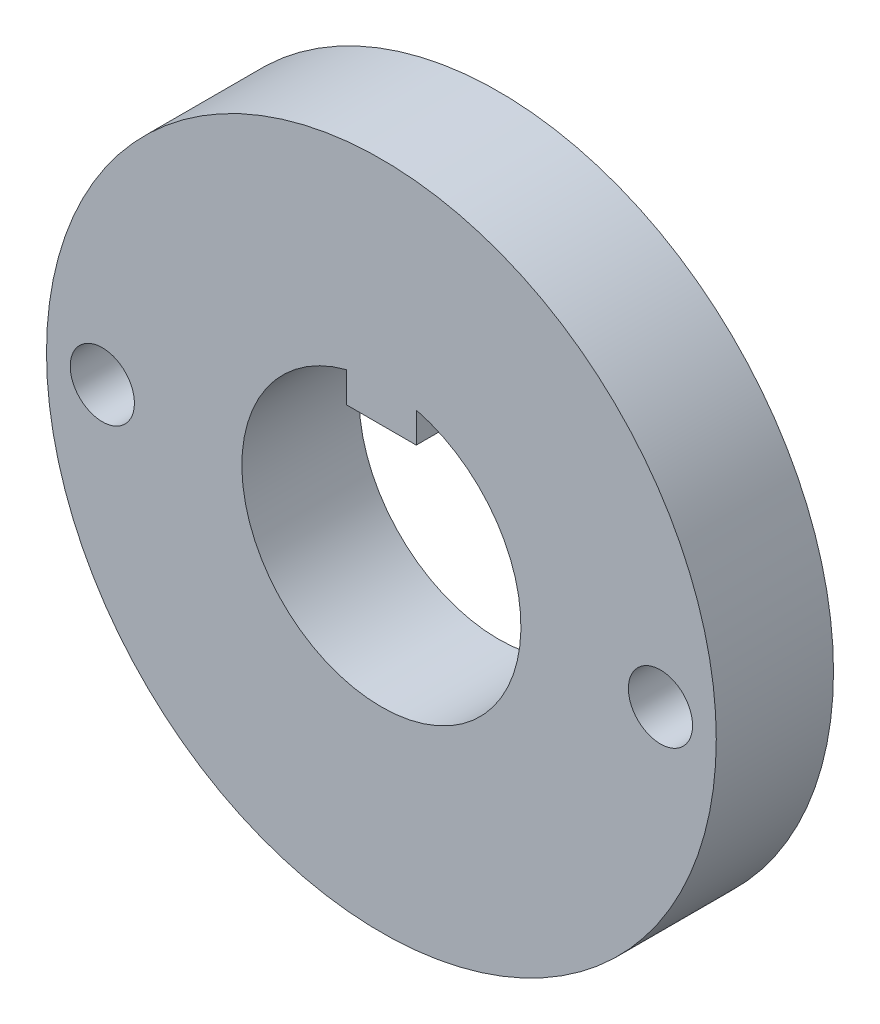
ISO-10303-21;
HEADER;
FILE_DESCRIPTION(('STEP AP214'),'2;1');
FILE_NAME('part.step','',(''),(''),'','','');
FILE_SCHEMA(('AUTOMOTIVE_DESIGN { 1 0 10303 214 1 1 1 1 }'));
ENDSEC;
DATA;
#1=APPLICATION_CONTEXT('core data for automotive mechanical design processes');
#2=APPLICATION_PROTOCOL_DEFINITION('international standard','automotive_design',2000,#1);
#3=PRODUCT_CONTEXT('',#1,'mechanical');
#4=PRODUCT('Part','Part','',(#3));
#5=PRODUCT_RELATED_PRODUCT_CATEGORY('part','',(#4));
#6=PRODUCT_DEFINITION_FORMATION('','',#4);
#7=PRODUCT_DEFINITION_CONTEXT('part definition',#1,'design');
#8=PRODUCT_DEFINITION('design','',#6,#7);
#9=PRODUCT_DEFINITION_SHAPE('','',#8);
#10=(LENGTH_UNIT() NAMED_UNIT(*) SI_UNIT(.MILLI.,.METRE.));
#11=(NAMED_UNIT(*) PLANE_ANGLE_UNIT() SI_UNIT($,.RADIAN.));
#12=(NAMED_UNIT(*) SI_UNIT($,.STERADIAN.) SOLID_ANGLE_UNIT());
#13=UNCERTAINTY_MEASURE_WITH_UNIT(LENGTH_MEASURE(1.E-05),#10,'distance_accuracy_value','');
#14=(GEOMETRIC_REPRESENTATION_CONTEXT(3) GLOBAL_UNCERTAINTY_ASSIGNED_CONTEXT((#13)) GLOBAL_UNIT_ASSIGNED_CONTEXT((#10,
#11,#12)) REPRESENTATION_CONTEXT('',''));
#15=CARTESIAN_POINT('',(0.,0.,0.));
#16=DIRECTION('',(0.,0.,1.));
#17=DIRECTION('',(1.,0.,0.));
#18=AXIS2_PLACEMENT_3D('',#15,#16,#17);
#19=CARTESIAN_POINT('',(0.,0.,2.667));
#20=DIRECTION('',(0.,0.,1.));
#21=DIRECTION('',(1.,0.,0.));
#22=AXIS2_PLACEMENT_3D('',#19,#20,#21);
#23=PLANE('',#22);
#24=CARTESIAN_POINT('',(-12.7,0.,2.667));
#25=DIRECTION('',(0.,0.,1.));
#26=DIRECTION('',(1.,0.,0.));
#27=AXIS2_PLACEMENT_3D('',#24,#25,#26);
#28=CIRCLE('',#27,1.46050000000001);
#29=CARTESIAN_POINT('',(-11.2395,0.,2.667));
#30=VERTEX_POINT('',#29);
#31=EDGE_CURVE('E109',#30,#30,#28,.T.);
#32=ORIENTED_EDGE('',*,*,#31,.F.);
#33=EDGE_LOOP('',(#32));
#34=FACE_BOUND('',#33,.T.);
#35=CARTESIAN_POINT('',(12.7,0.,2.667));
#36=DIRECTION('',(0.,0.,1.));
#37=DIRECTION('',(1.,0.,0.));
#38=AXIS2_PLACEMENT_3D('',#35,#36,#37);
#39=CIRCLE('',#38,1.4605);
#40=CARTESIAN_POINT('',(14.1605,0.,2.667));
#41=VERTEX_POINT('',#40);
#42=EDGE_CURVE('E116',#41,#41,#39,.T.);
#43=ORIENTED_EDGE('',*,*,#42,.F.);
#44=EDGE_LOOP('',(#43));
#45=FACE_BOUND('',#44,.T.);
#46=CARTESIAN_POINT('',(0.,0.,2.667));
#47=DIRECTION('',(0.,0.,1.));
#48=DIRECTION('',(1.,0.,0.));
#49=AXIS2_PLACEMENT_3D('',#46,#47,#48);
#50=CIRCLE('',#49,15.24);
#51=CARTESIAN_POINT('',(15.24,0.,2.667));
#52=VERTEX_POINT('',#51);
#53=EDGE_CURVE('E11',#52,#52,#50,.T.);
#54=ORIENTED_EDGE('',*,*,#53,.T.);
#55=EDGE_LOOP('',(#54));
#56=FACE_BOUND('',#55,.T.);
#57=CARTESIAN_POINT('',(0.,0.,2.667));
#58=DIRECTION('',(0.,0.,1.));
#59=DIRECTION('',(1.,0.,0.));
#60=AXIS2_PLACEMENT_3D('',#57,#58,#59);
#61=CIRCLE('',#60,6.35);
#62=CARTESIAN_POINT('',(-1.5875,6.14836106210427,2.667));
#63=VERTEX_POINT('',#62);
#64=CARTESIAN_POINT('',(1.5875,6.14836106210427,2.667));
#65=VERTEX_POINT('',#64);
#66=EDGE_CURVE('E63',#63,#65,#61,.T.);
#67=ORIENTED_EDGE('',*,*,#66,.F.);
#68=DIRECTION('',(0.,-1.,0.));
#69=VECTOR('',#68,1.);
#70=CARTESIAN_POINT('',(-1.5875,0.,2.667));
#71=LINE('',#70,#69);
#72=CARTESIAN_POINT('',(-1.5875,4.7625,2.667));
#73=VERTEX_POINT('',#72);
#74=EDGE_CURVE('E106',#63,#73,#71,.T.);
#75=ORIENTED_EDGE('',*,*,#74,.T.);
#76=DIRECTION('',(1.,0.,0.));
#77=VECTOR('',#76,1.);
#78=CARTESIAN_POINT('',(0.,4.7625,2.667));
#79=LINE('',#78,#77);
#80=CARTESIAN_POINT('',(1.5875,4.7625,2.667));
#81=VERTEX_POINT('',#80);
#82=EDGE_CURVE('E55',#73,#81,#79,.T.);
#83=ORIENTED_EDGE('',*,*,#82,.T.);
#84=DIRECTION('',(0.,-1.,0.));
#85=VECTOR('',#84,1.);
#86=CARTESIAN_POINT('',(1.5875,0.,2.667));
#87=LINE('',#86,#85);
#88=EDGE_CURVE('E49',#65,#81,#87,.T.);
#89=ORIENTED_EDGE('',*,*,#88,.F.);
#90=EDGE_LOOP('',(#67,#75,#83,#89));
#91=FACE_BOUND('',#90,.T.);
#92=ADVANCED_FACE('F34',(#34,#45,#56,#91),#23,.T.);
#93=CARTESIAN_POINT('',(0.,0.,-2.667));
#94=DIRECTION('',(0.,0.,1.));
#95=DIRECTION('',(1.,0.,0.));
#96=AXIS2_PLACEMENT_3D('',#93,#94,#95);
#97=PLANE('',#96);
#98=CARTESIAN_POINT('',(-12.7,0.,-2.667));
#99=DIRECTION('',(0.,0.,1.));
#100=DIRECTION('',(1.,0.,0.));
#101=AXIS2_PLACEMENT_3D('',#98,#99,#100);
#102=CIRCLE('',#101,1.46050000000001);
#103=CARTESIAN_POINT('',(-11.2395,0.,-2.667));
#104=VERTEX_POINT('',#103);
#105=EDGE_CURVE('E113',#104,#104,#102,.T.);
#106=ORIENTED_EDGE('',*,*,#105,.T.);
#107=EDGE_LOOP('',(#106));
#108=FACE_BOUND('',#107,.T.);
#109=CARTESIAN_POINT('',(12.7,0.,-2.667));
#110=DIRECTION('',(0.,0.,1.));
#111=DIRECTION('',(1.,0.,0.));
#112=AXIS2_PLACEMENT_3D('',#109,#110,#111);
#113=CIRCLE('',#112,1.4605);
#114=CARTESIAN_POINT('',(14.1605,0.,-2.667));
#115=VERTEX_POINT('',#114);
#116=EDGE_CURVE('E119',#115,#115,#113,.T.);
#117=ORIENTED_EDGE('',*,*,#116,.T.);
#118=EDGE_LOOP('',(#117));
#119=FACE_BOUND('',#118,.T.);
#120=CARTESIAN_POINT('',(0.,0.,-2.667));
#121=DIRECTION('',(0.,0.,1.));
#122=DIRECTION('',(1.,0.,0.));
#123=AXIS2_PLACEMENT_3D('',#120,#121,#122);
#124=CIRCLE('',#123,15.24);
#125=CARTESIAN_POINT('',(15.24,0.,-2.667));
#126=VERTEX_POINT('',#125);
#127=EDGE_CURVE('E38',#126,#126,#124,.T.);
#128=ORIENTED_EDGE('',*,*,#127,.F.);
#129=EDGE_LOOP('',(#128));
#130=FACE_BOUND('',#129,.T.);
#131=DIRECTION('',(0.,1.,0.));
#132=VECTOR('',#131,1.);
#133=CARTESIAN_POINT('',(1.5875,0.,-2.667));
#134=LINE('',#133,#132);
#135=CARTESIAN_POINT('',(1.5875,4.7625,-2.667));
#136=VERTEX_POINT('',#135);
#137=CARTESIAN_POINT('',(1.5875,6.14836106210427,-2.667));
#138=VERTEX_POINT('',#137);
#139=EDGE_CURVE('E98',#136,#138,#134,.T.);
#140=ORIENTED_EDGE('',*,*,#139,.F.);
#141=DIRECTION('',(-1.,0.,0.));
#142=VECTOR('',#141,1.);
#143=CARTESIAN_POINT('',(0.,4.7625,-2.667));
#144=LINE('',#143,#142);
#145=CARTESIAN_POINT('',(-1.5875,4.7625,-2.667));
#146=VERTEX_POINT('',#145);
#147=EDGE_CURVE('E88',#136,#146,#144,.T.);
#148=ORIENTED_EDGE('',*,*,#147,.T.);
#149=DIRECTION('',(0.,1.,0.));
#150=VECTOR('',#149,1.);
#151=CARTESIAN_POINT('',(-1.5875,0.,-2.667));
#152=LINE('',#151,#150);
#153=CARTESIAN_POINT('',(-1.5875,6.14836106210427,-2.667));
#154=VERTEX_POINT('',#153);
#155=EDGE_CURVE('E97',#146,#154,#152,.T.);
#156=ORIENTED_EDGE('',*,*,#155,.T.);
#157=CARTESIAN_POINT('',(0.,0.,-2.667));
#158=DIRECTION('',(0.,0.,1.));
#159=DIRECTION('',(1.,0.,0.));
#160=AXIS2_PLACEMENT_3D('',#157,#158,#159);
#161=CIRCLE('',#160,6.35);
#162=EDGE_CURVE('E162',#138,#154,#161,.F.);
#163=ORIENTED_EDGE('',*,*,#162,.F.);
#164=EDGE_LOOP('',(#140,#148,#156,#163));
#165=FACE_BOUND('',#164,.T.);
#166=ADVANCED_FACE('F96',(#108,#119,#130,#165),#97,.F.);
#167=CARTESIAN_POINT('',(0.,0.,2.667));
#168=DIRECTION('',(0.,0.,-1.));
#169=DIRECTION('',(-1.,0.,0.));
#170=AXIS2_PLACEMENT_3D('',#167,#168,#169);
#171=CYLINDRICAL_SURFACE('',#170,15.24);
#172=ORIENTED_EDGE('',*,*,#53,.F.);
#173=EDGE_LOOP('',(#172));
#174=FACE_BOUND('',#173,.T.);
#175=ORIENTED_EDGE('',*,*,#127,.T.);
#176=EDGE_LOOP('',(#175));
#177=FACE_BOUND('',#176,.T.);
#178=ADVANCED_FACE('F36',(#174,#177),#171,.T.);
#179=CARTESIAN_POINT('',(12.7,0.,-2.667));
#180=DIRECTION('',(0.,0.,1.));
#181=DIRECTION('',(1.,0.,0.));
#182=AXIS2_PLACEMENT_3D('',#179,#180,#181);
#183=CYLINDRICAL_SURFACE('',#182,1.4605);
#184=ORIENTED_EDGE('',*,*,#116,.F.);
#185=EDGE_LOOP('',(#184));
#186=FACE_BOUND('',#185,.T.);
#187=ORIENTED_EDGE('',*,*,#42,.T.);
#188=EDGE_LOOP('',(#187));
#189=FACE_BOUND('',#188,.T.);
#190=ADVANCED_FACE('F125',(#186,#189),#183,.F.);
#191=CARTESIAN_POINT('',(-12.7,0.,-2.667));
#192=DIRECTION('',(0.,0.,1.));
#193=DIRECTION('',(1.,0.,0.));
#194=AXIS2_PLACEMENT_3D('',#191,#192,#193);
#195=CYLINDRICAL_SURFACE('',#194,1.46050000000001);
#196=ORIENTED_EDGE('',*,*,#105,.F.);
#197=EDGE_LOOP('',(#196));
#198=FACE_BOUND('',#197,.T.);
#199=ORIENTED_EDGE('',*,*,#31,.T.);
#200=EDGE_LOOP('',(#199));
#201=FACE_BOUND('',#200,.T.);
#202=ADVANCED_FACE('F146',(#198,#201),#195,.F.);
#203=CARTESIAN_POINT('',(0.,0.,29.6077683632075));
#204=DIRECTION('',(0.,0.,-1.));
#205=DIRECTION('',(-1.,0.,0.));
#206=AXIS2_PLACEMENT_3D('',#203,#204,#205);
#207=CYLINDRICAL_SURFACE('',#206,6.35);
#208=DIRECTION('',(0.,0.,-1.));
#209=VECTOR('',#208,1.);
#210=CARTESIAN_POINT('',(-1.5875,6.14836106210427,29.6077683632075));
#211=LINE('',#210,#209);
#212=EDGE_CURVE('E92',#63,#154,#211,.T.);
#213=ORIENTED_EDGE('',*,*,#212,.F.);
#214=ORIENTED_EDGE('',*,*,#66,.T.);
#215=DIRECTION('',(0.,0.,-1.));
#216=VECTOR('',#215,1.);
#217=CARTESIAN_POINT('',(1.5875,6.14836106210427,29.6077683632075));
#218=LINE('',#217,#216);
#219=EDGE_CURVE('E70',#65,#138,#218,.T.);
#220=ORIENTED_EDGE('',*,*,#219,.T.);
#221=ORIENTED_EDGE('',*,*,#162,.T.);
#222=EDGE_LOOP('',(#213,#214,#220,#221));
#223=FACE_BOUND('',#222,.T.);
#224=ADVANCED_FACE('F150',(#223),#207,.F.);
#225=CARTESIAN_POINT('',(-1.5875,0.,29.6077683632075));
#226=DIRECTION('',(1.,0.,0.));
#227=DIRECTION('',(0.,1.,0.));
#228=AXIS2_PLACEMENT_3D('',#225,#226,#227);
#229=PLANE('',#228);
#230=ORIENTED_EDGE('',*,*,#74,.F.);
#231=ORIENTED_EDGE('',*,*,#212,.T.);
#232=ORIENTED_EDGE('',*,*,#155,.F.);
#233=DIRECTION('',(0.,0.,-1.));
#234=VECTOR('',#233,1.);
#235=CARTESIAN_POINT('',(-1.5875,4.7625,29.6077683632075));
#236=LINE('',#235,#234);
#237=EDGE_CURVE('E85',#73,#146,#236,.T.);
#238=ORIENTED_EDGE('',*,*,#237,.F.);
#239=EDGE_LOOP('',(#230,#231,#232,#238));
#240=FACE_BOUND('',#239,.T.);
#241=ADVANCED_FACE('F100',(#240),#229,.F.);
#242=CARTESIAN_POINT('',(0.,4.7625,29.6077683632075));
#243=DIRECTION('',(0.,1.,0.));
#244=DIRECTION('',(0.,0.,1.));
#245=AXIS2_PLACEMENT_3D('',#242,#243,#244);
#246=PLANE('',#245);
#247=ORIENTED_EDGE('',*,*,#82,.F.);
#248=ORIENTED_EDGE('',*,*,#237,.T.);
#249=ORIENTED_EDGE('',*,*,#147,.F.);
#250=DIRECTION('',(0.,0.,-1.));
#251=VECTOR('',#250,1.);
#252=CARTESIAN_POINT('',(1.5875,4.7625,29.6077683632075));
#253=LINE('',#252,#251);
#254=EDGE_CURVE('E79',#81,#136,#253,.T.);
#255=ORIENTED_EDGE('',*,*,#254,.F.);
#256=EDGE_LOOP('',(#247,#248,#249,#255));
#257=FACE_BOUND('',#256,.T.);
#258=ADVANCED_FACE('F87',(#257),#246,.F.);
#259=CARTESIAN_POINT('',(1.5875,0.,29.6077683632075));
#260=DIRECTION('',(1.,0.,0.));
#261=DIRECTION('',(0.,1.,0.));
#262=AXIS2_PLACEMENT_3D('',#259,#260,#261);
#263=PLANE('',#262);
#264=ORIENTED_EDGE('',*,*,#219,.F.);
#265=ORIENTED_EDGE('',*,*,#88,.T.);
#266=ORIENTED_EDGE('',*,*,#254,.T.);
#267=ORIENTED_EDGE('',*,*,#139,.T.);
#268=EDGE_LOOP('',(#264,#265,#266,#267));
#269=FACE_BOUND('',#268,.T.);
#270=ADVANCED_FACE('F158',(#269),#263,.T.);
#271=CLOSED_SHELL('',(#92,#166,#178,#190,#202,#224,#241,#258,#270));
#272=MANIFOLD_SOLID_BREP('B2',#271);
#273=ADVANCED_BREP_SHAPE_REPRESENTATION('',(#18,#272),#14);
#274=SHAPE_DEFINITION_REPRESENTATION(#9,#273);
ENDSEC;
END-ISO-10303-21;
